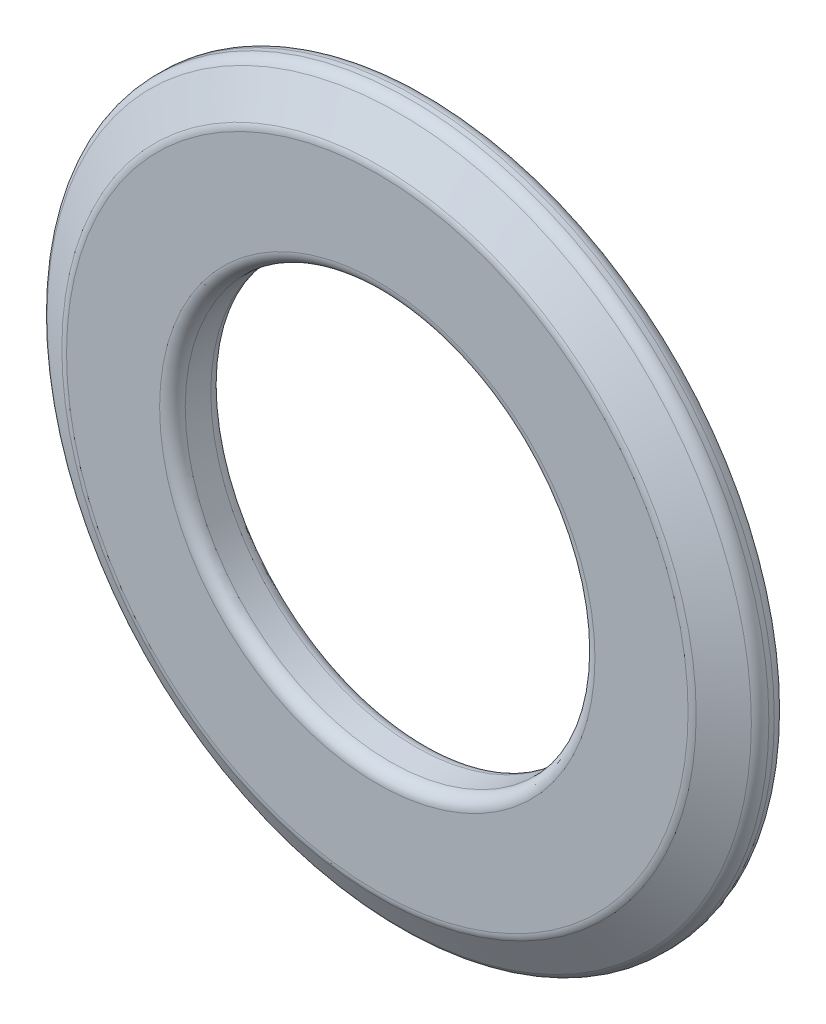
ISO-10303-21;
HEADER;
FILE_DESCRIPTION(('STEP AP214'),'2;1');
FILE_NAME('part.step','',(''),(''),'','','');
FILE_SCHEMA(('AUTOMOTIVE_DESIGN { 1 0 10303 214 1 1 1 1 }'));
ENDSEC;
DATA;
#1=APPLICATION_CONTEXT('core data for automotive mechanical design processes');
#2=APPLICATION_PROTOCOL_DEFINITION('international standard','automotive_design',2000,#1);
#3=PRODUCT_CONTEXT('',#1,'mechanical');
#4=PRODUCT('Part','Part','',(#3));
#5=PRODUCT_RELATED_PRODUCT_CATEGORY('part','',(#4));
#6=PRODUCT_DEFINITION_FORMATION('','',#4);
#7=PRODUCT_DEFINITION_CONTEXT('part definition',#1,'design');
#8=PRODUCT_DEFINITION('design','',#6,#7);
#9=PRODUCT_DEFINITION_SHAPE('','',#8);
#10=(LENGTH_UNIT() NAMED_UNIT(*) SI_UNIT(.MILLI.,.METRE.));
#11=(NAMED_UNIT(*) PLANE_ANGLE_UNIT() SI_UNIT($,.RADIAN.));
#12=(NAMED_UNIT(*) SI_UNIT($,.STERADIAN.) SOLID_ANGLE_UNIT());
#13=UNCERTAINTY_MEASURE_WITH_UNIT(LENGTH_MEASURE(1.E-05),#10,'distance_accuracy_value','');
#14=(GEOMETRIC_REPRESENTATION_CONTEXT(3) GLOBAL_UNCERTAINTY_ASSIGNED_CONTEXT((#13)) GLOBAL_UNIT_ASSIGNED_CONTEXT((#10,
#11,#12)) REPRESENTATION_CONTEXT('',''));
#15=CARTESIAN_POINT('',(0.,0.,0.));
#16=DIRECTION('',(0.,0.,1.));
#17=DIRECTION('',(1.,0.,0.));
#18=AXIS2_PLACEMENT_3D('',#15,#16,#17);
#19=CARTESIAN_POINT('',(15.2300359001178,-44.7825386860171,1.));
#20=DIRECTION('',(0.,0.,1.));
#21=DIRECTION('',(1.,0.,0.));
#22=AXIS2_PLACEMENT_3D('',#19,#20,#21);
#23=PLANE('',#22);
#24=CARTESIAN_POINT('',(15.2300359001178,-44.7825386860171,1.));
#25=DIRECTION('',(0.,0.,1.));
#26=DIRECTION('',(1.,0.,0.));
#27=AXIS2_PLACEMENT_3D('',#24,#25,#26);
#28=CIRCLE('',#27,4.25);
#29=CARTESIAN_POINT('',(19.4800359001178,-44.7825386860171,1.));
#30=VERTEX_POINT('',#29);
#31=EDGE_CURVE('E10',#30,#30,#28,.F.);
#32=ORIENTED_EDGE('',*,*,#31,.T.);
#33=EDGE_LOOP('',(#32));
#34=FACE_BOUND('',#33,.T.);
#35=CARTESIAN_POINT('',(15.2300359001178,-44.7825386860171,1.));
#36=DIRECTION('',(0.,0.,1.));
#37=DIRECTION('',(1.,0.,0.));
#38=AXIS2_PLACEMENT_3D('',#35,#36,#37);
#39=CIRCLE('',#38,6.06698729810778);
#40=CARTESIAN_POINT('',(21.2970231982256,-44.7825386860171,1.));
#41=VERTEX_POINT('',#40);
#42=EDGE_CURVE('E37',#41,#41,#39,.T.);
#43=ORIENTED_EDGE('',*,*,#42,.T.);
#44=EDGE_LOOP('',(#43));
#45=FACE_BOUND('',#44,.T.);
#46=ADVANCED_FACE('F30',(#34,#45),#23,.T.);
#47=CARTESIAN_POINT('',(15.2300359001178,-44.7825386860171,0.));
#48=DIRECTION('',(0.,0.,1.));
#49=DIRECTION('',(1.,0.,0.));
#50=AXIS2_PLACEMENT_3D('',#47,#48,#49);
#51=PLANE('',#50);
#52=CARTESIAN_POINT('',(15.2300359001178,-44.7825386860171,0.));
#53=DIRECTION('',(0.,0.,1.));
#54=DIRECTION('',(1.,0.,0.));
#55=AXIS2_PLACEMENT_3D('',#52,#53,#54);
#56=CIRCLE('',#55,4.25);
#57=CARTESIAN_POINT('',(19.4800359001178,-44.7825386860171,0.));
#58=VERTEX_POINT('',#57);
#59=EDGE_CURVE('E62',#58,#58,#56,.T.);
#60=ORIENTED_EDGE('',*,*,#59,.T.);
#61=EDGE_LOOP('',(#60));
#62=FACE_BOUND('',#61,.T.);
#63=CARTESIAN_POINT('',(15.2300359001178,-44.7825386860171,0.));
#64=DIRECTION('',(0.,0.,1.));
#65=DIRECTION('',(1.,0.,0.));
#66=AXIS2_PLACEMENT_3D('',#63,#64,#65);
#67=CIRCLE('',#66,6.75);
#68=CARTESIAN_POINT('',(21.9800359001178,-44.7825386860171,0.));
#69=VERTEX_POINT('',#68);
#70=EDGE_CURVE('E65',#69,#69,#67,.F.);
#71=ORIENTED_EDGE('',*,*,#70,.T.);
#72=EDGE_LOOP('',(#71));
#73=FACE_BOUND('',#72,.T.);
#74=ADVANCED_FACE('F69',(#62,#73),#51,.F.);
#75=CARTESIAN_POINT('',(15.2300359001178,-44.7825386860171,1.));
#76=DIRECTION('',(0.,0.,-1.));
#77=DIRECTION('',(-1.,0.,0.));
#78=AXIS2_PLACEMENT_3D('',#75,#76,#77);
#79=CYLINDRICAL_SURFACE('',#78,7.);
#80=CARTESIAN_POINT('',(15.2300359001178,-44.7825386860171,0.25));
#81=DIRECTION('',(0.,0.,1.));
#82=DIRECTION('',(1.,0.,0.));
#83=AXIS2_PLACEMENT_3D('',#80,#81,#82);
#84=CIRCLE('',#83,7.);
#85=CARTESIAN_POINT('',(22.2300359001178,-44.7825386860171,0.25));
#86=VERTEX_POINT('',#85);
#87=EDGE_CURVE('E50',#86,#86,#84,.T.);
#88=ORIENTED_EDGE('',*,*,#87,.T.);
#89=EDGE_LOOP('',(#88));
#90=FACE_BOUND('',#89,.T.);
#91=CARTESIAN_POINT('',(15.2300359001178,-44.7825386860171,0.355662432702595));
#92=DIRECTION('',(0.,0.,1.));
#93=DIRECTION('',(1.,0.,0.));
#94=AXIS2_PLACEMENT_3D('',#91,#92,#93);
#95=CIRCLE('',#94,7.);
#96=CARTESIAN_POINT('',(22.2300359001178,-44.7825386860171,0.355662432702595));
#97=VERTEX_POINT('',#96);
#98=EDGE_CURVE('E53',#97,#97,#95,.F.);
#99=ORIENTED_EDGE('',*,*,#98,.T.);
#100=EDGE_LOOP('',(#99));
#101=FACE_BOUND('',#100,.T.);
#102=ADVANCED_FACE('F79',(#90,#101),#79,.T.);
#103=CARTESIAN_POINT('',(15.2300359001178,-44.7825386860171,1.));
#104=DIRECTION('',(0.,0.,-1.));
#105=DIRECTION('',(-1.,0.,0.));
#106=AXIS2_PLACEMENT_3D('',#103,#104,#105);
#107=CYLINDRICAL_SURFACE('',#106,4.);
#108=CARTESIAN_POINT('',(15.2300359001178,-44.7825386860171,0.25));
#109=DIRECTION('',(0.,0.,1.));
#110=DIRECTION('',(1.,0.,0.));
#111=AXIS2_PLACEMENT_3D('',#108,#109,#110);
#112=CIRCLE('',#111,4.);
#113=CARTESIAN_POINT('',(19.2300359001178,-44.7825386860171,0.25));
#114=VERTEX_POINT('',#113);
#115=EDGE_CURVE('E56',#114,#114,#112,.F.);
#116=ORIENTED_EDGE('',*,*,#115,.T.);
#117=EDGE_LOOP('',(#116));
#118=FACE_BOUND('',#117,.T.);
#119=CARTESIAN_POINT('',(15.2300359001178,-44.7825386860171,0.75));
#120=DIRECTION('',(0.,0.,1.));
#121=DIRECTION('',(1.,0.,0.));
#122=AXIS2_PLACEMENT_3D('',#119,#120,#121);
#123=CIRCLE('',#122,4.);
#124=CARTESIAN_POINT('',(19.2300359001178,-44.7825386860171,0.75));
#125=VERTEX_POINT('',#124);
#126=EDGE_CURVE('E59',#125,#125,#123,.T.);
#127=ORIENTED_EDGE('',*,*,#126,.T.);
#128=EDGE_LOOP('',(#127));
#129=FACE_BOUND('',#128,.T.);
#130=ADVANCED_FACE('F82',(#118,#129),#107,.F.);
#131=CARTESIAN_POINT('',(15.2300359001178,-44.7825386860171,1.));
#132=DIRECTION('',(0.,0.,-1.));
#133=DIRECTION('',(-1.,0.,0.));
#134=AXIS2_PLACEMENT_3D('',#131,#132,#133);
#135=CONICAL_SURFACE('',#134,6.13397459621556,1.0471975511966);
#136=CARTESIAN_POINT('',(15.2300359001178,-44.7825386860171,0.572168783648705));
#137=DIRECTION('',(0.,0.,-1.));
#138=DIRECTION('',(-1.,0.,0.));
#139=AXIS2_PLACEMENT_3D('',#136,#137,#138);
#140=CIRCLE('',#139,6.875);
#141=CARTESIAN_POINT('',(8.35503590011784,-44.7825386860171,0.572168783648705));
#142=VERTEX_POINT('',#141);
#143=EDGE_CURVE('E41',#142,#142,#140,.F.);
#144=ORIENTED_EDGE('',*,*,#143,.T.);
#145=EDGE_LOOP('',(#144));
#146=FACE_BOUND('',#145,.T.);
#147=CARTESIAN_POINT('',(15.2300359001178,-44.7825386860171,0.96650635094611));
#148=DIRECTION('',(0.,0.,1.));
#149=DIRECTION('',(1.,0.,0.));
#150=AXIS2_PLACEMENT_3D('',#147,#148,#149);
#151=CIRCLE('',#150,6.19198729810778);
#152=CARTESIAN_POINT('',(21.4220231982256,-44.7825386860171,0.96650635094611));
#153=VERTEX_POINT('',#152);
#154=EDGE_CURVE('E45',#153,#153,#151,.F.);
#155=ORIENTED_EDGE('',*,*,#154,.T.);
#156=EDGE_LOOP('',(#155));
#157=FACE_BOUND('',#156,.T.);
#158=ADVANCED_FACE('F104',(#146,#157),#135,.T.);
#159=CARTESIAN_POINT('',(15.2300359001178,-44.7825386860171,0.25));
#160=DIRECTION('',(0.,0.,1.));
#161=DIRECTION('',(1.,0.,0.));
#162=AXIS2_PLACEMENT_3D('',#159,#160,#161);
#163=TOROIDAL_SURFACE('',#162,4.25,0.25);
#164=ORIENTED_EDGE('',*,*,#115,.F.);
#165=EDGE_LOOP('',(#164));
#166=FACE_BOUND('',#165,.T.);
#167=ORIENTED_EDGE('',*,*,#59,.F.);
#168=EDGE_LOOP('',(#167));
#169=FACE_BOUND('',#168,.T.);
#170=ADVANCED_FACE('F75',(#166,#169),#163,.T.);
#171=CARTESIAN_POINT('',(15.2300359001178,-44.7825386860171,0.25));
#172=DIRECTION('',(0.,0.,1.));
#173=DIRECTION('',(1.,0.,0.));
#174=AXIS2_PLACEMENT_3D('',#171,#172,#173);
#175=TOROIDAL_SURFACE('',#174,6.75,0.25);
#176=ORIENTED_EDGE('',*,*,#70,.F.);
#177=EDGE_LOOP('',(#176));
#178=FACE_BOUND('',#177,.T.);
#179=ORIENTED_EDGE('',*,*,#87,.F.);
#180=EDGE_LOOP('',(#179));
#181=FACE_BOUND('',#180,.T.);
#182=ADVANCED_FACE('F71',(#178,#181),#175,.T.);
#183=CARTESIAN_POINT('',(15.2300359001178,-44.7825386860171,0.355662432702595));
#184=DIRECTION('',(0.,0.,1.));
#185=DIRECTION('',(1.,0.,0.));
#186=AXIS2_PLACEMENT_3D('',#183,#184,#185);
#187=TOROIDAL_SURFACE('',#186,6.75,0.25);
#188=ORIENTED_EDGE('',*,*,#143,.F.);
#189=EDGE_LOOP('',(#188));
#190=FACE_BOUND('',#189,.T.);
#191=ORIENTED_EDGE('',*,*,#98,.F.);
#192=EDGE_LOOP('',(#191));
#193=FACE_BOUND('',#192,.T.);
#194=ADVANCED_FACE('F74',(#190,#193),#187,.T.);
#195=CARTESIAN_POINT('',(15.2300359001178,-44.7825386860171,0.75));
#196=DIRECTION('',(0.,0.,1.));
#197=DIRECTION('',(1.,0.,0.));
#198=AXIS2_PLACEMENT_3D('',#195,#196,#197);
#199=TOROIDAL_SURFACE('',#198,4.25,0.25);
#200=ORIENTED_EDGE('',*,*,#31,.F.);
#201=EDGE_LOOP('',(#200));
#202=FACE_BOUND('',#201,.T.);
#203=ORIENTED_EDGE('',*,*,#126,.F.);
#204=EDGE_LOOP('',(#203));
#205=FACE_BOUND('',#204,.T.);
#206=ADVANCED_FACE('F87',(#202,#205),#199,.T.);
#207=CARTESIAN_POINT('',(15.2300359001178,-44.7825386860171,0.75));
#208=DIRECTION('',(0.,0.,1.));
#209=DIRECTION('',(1.,0.,0.));
#210=AXIS2_PLACEMENT_3D('',#207,#208,#209);
#211=TOROIDAL_SURFACE('',#210,6.06698729810778,0.25);
#212=ORIENTED_EDGE('',*,*,#154,.F.);
#213=EDGE_LOOP('',(#212));
#214=FACE_BOUND('',#213,.T.);
#215=ORIENTED_EDGE('',*,*,#42,.F.);
#216=EDGE_LOOP('',(#215));
#217=FACE_BOUND('',#216,.T.);
#218=ADVANCED_FACE('F32',(#214,#217),#211,.T.);
#219=CLOSED_SHELL('',(#46,#74,#102,#130,#158,#170,#182,#194,#206,#218));
#220=MANIFOLD_SOLID_BREP('B2',#219);
#221=ADVANCED_BREP_SHAPE_REPRESENTATION('',(#18,#220),#14);
#222=SHAPE_DEFINITION_REPRESENTATION(#9,#221);
ENDSEC;
END-ISO-10303-21;
